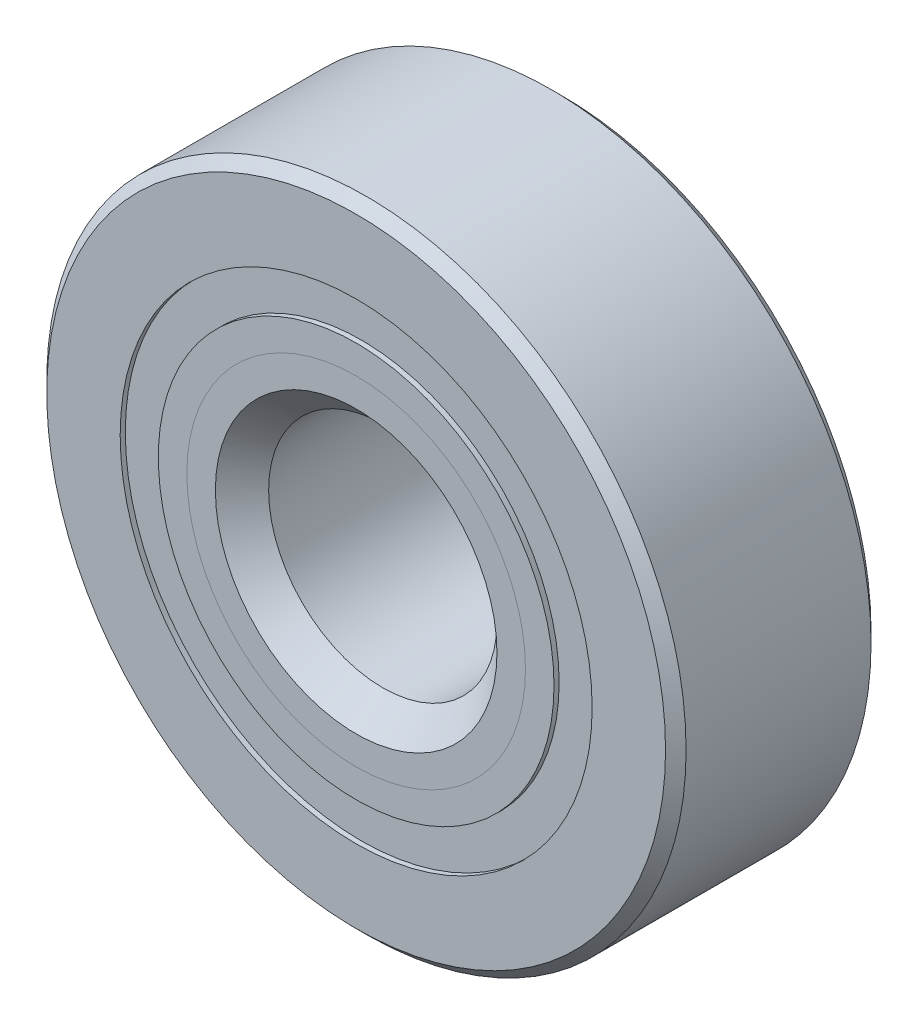
ISO-10303-21;
HEADER;
FILE_DESCRIPTION(('STEP AP214'),'2;1');
FILE_NAME('part.step','',(''),(''),'','','');
FILE_SCHEMA(('AUTOMOTIVE_DESIGN { 1 0 10303 214 1 1 1 1 }'));
ENDSEC;
DATA;
#1=APPLICATION_CONTEXT('core data for automotive mechanical design processes');
#2=APPLICATION_PROTOCOL_DEFINITION('international standard','automotive_design',2000,#1);
#3=PRODUCT_CONTEXT('',#1,'mechanical');
#4=PRODUCT('Part','Part','',(#3));
#5=PRODUCT_RELATED_PRODUCT_CATEGORY('part','',(#4));
#6=PRODUCT_DEFINITION_FORMATION('','',#4);
#7=PRODUCT_DEFINITION_CONTEXT('part definition',#1,'design');
#8=PRODUCT_DEFINITION('design','',#6,#7);
#9=PRODUCT_DEFINITION_SHAPE('','',#8);
#10=(LENGTH_UNIT() NAMED_UNIT(*) SI_UNIT(.MILLI.,.METRE.));
#11=(NAMED_UNIT(*) PLANE_ANGLE_UNIT() SI_UNIT($,.RADIAN.));
#12=(NAMED_UNIT(*) SI_UNIT($,.STERADIAN.) SOLID_ANGLE_UNIT());
#13=UNCERTAINTY_MEASURE_WITH_UNIT(LENGTH_MEASURE(1.E-05),#10,'distance_accuracy_value','');
#14=(GEOMETRIC_REPRESENTATION_CONTEXT(3) GLOBAL_UNCERTAINTY_ASSIGNED_CONTEXT((#13)) GLOBAL_UNIT_ASSIGNED_CONTEXT((#10,
#11,#12)) REPRESENTATION_CONTEXT('',''));
#15=CARTESIAN_POINT('',(0.,0.,0.));
#16=DIRECTION('',(0.,0.,1.));
#17=DIRECTION('',(1.,0.,0.));
#18=AXIS2_PLACEMENT_3D('',#15,#16,#17);
#19=CARTESIAN_POINT('',(0.,8.20353708791208,-3.39328125));
#20=DIRECTION('',(0.,0.,1.));
#21=DIRECTION('',(1.,0.,0.));
#22=AXIS2_PLACEMENT_3D('',#19,#20,#21);
#23=PLANE('',#22);
#24=CARTESIAN_POINT('',(0.,0.,-3.39328125000001));
#25=DIRECTION('',(0.,0.,1.));
#26=DIRECTION('',(1.,0.,0.));
#27=AXIS2_PLACEMENT_3D('',#24,#25,#26);
#28=CIRCLE('',#27,8.20353708791208);
#29=CARTESIAN_POINT('',(8.20353708791208,0.,-3.39328125000001));
#30=VERTEX_POINT('',#29);
#31=EDGE_CURVE('E60',#30,#30,#28,.T.);
#32=ORIENTED_EDGE('',*,*,#31,.F.);
#33=EDGE_LOOP('',(#32));
#34=FACE_BOUND('',#33,.T.);
#35=CARTESIAN_POINT('',(0.,0.,-3.39328125));
#36=DIRECTION('',(0.,0.,1.));
#37=DIRECTION('',(1.,0.,0.));
#38=AXIS2_PLACEMENT_3D('',#35,#36,#37);
#39=CIRCLE('',#38,6.87771291208791);
#40=CARTESIAN_POINT('',(6.87771291208791,0.,-3.39328125));
#41=VERTEX_POINT('',#40);
#42=EDGE_CURVE('E11',#41,#41,#39,.T.);
#43=ORIENTED_EDGE('',*,*,#42,.T.);
#44=EDGE_LOOP('',(#43));
#45=FACE_BOUND('',#44,.T.);
#46=ADVANCED_FACE('F46',(#34,#45),#23,.F.);
#47=CARTESIAN_POINT('',(0.,0.,3.571875));
#48=DIRECTION('',(0.,0.,1.));
#49=DIRECTION('',(1.,0.,0.));
#50=AXIS2_PLACEMENT_3D('',#47,#48,#49);
#51=CYLINDRICAL_SURFACE('',#50,6.87771291208791);
#52=ORIENTED_EDGE('',*,*,#42,.F.);
#53=EDGE_LOOP('',(#52));
#54=FACE_BOUND('',#53,.T.);
#55=CARTESIAN_POINT('',(0.,0.,-1.72035132641562));
#56=DIRECTION('',(0.,0.,1.));
#57=DIRECTION('',(1.,0.,0.));
#58=AXIS2_PLACEMENT_3D('',#55,#56,#57);
#59=CIRCLE('',#58,6.87771291208791);
#60=CARTESIAN_POINT('',(6.87771291208791,0.,-1.72035132641562));
#61=VERTEX_POINT('',#60);
#62=EDGE_CURVE('E52',#61,#61,#59,.T.);
#63=ORIENTED_EDGE('',*,*,#62,.T.);
#64=EDGE_LOOP('',(#63));
#65=FACE_BOUND('',#64,.T.);
#66=ADVANCED_FACE('F69',(#54,#65),#51,.F.);
#67=CARTESIAN_POINT('',(0.,8.20353708791208,-1.72035132641562));
#68=DIRECTION('',(0.,0.,-1.));
#69=DIRECTION('',(-1.,0.,0.));
#70=AXIS2_PLACEMENT_3D('',#67,#68,#69);
#71=PLANE('',#70);
#72=ORIENTED_EDGE('',*,*,#62,.F.);
#73=EDGE_LOOP('',(#72));
#74=FACE_BOUND('',#73,.T.);
#75=CARTESIAN_POINT('',(0.,0.,-1.72035132641562));
#76=DIRECTION('',(0.,0.,1.));
#77=DIRECTION('',(1.,0.,0.));
#78=AXIS2_PLACEMENT_3D('',#75,#76,#77);
#79=CIRCLE('',#78,8.20353708791208);
#80=CARTESIAN_POINT('',(8.20353708791208,0.,-1.72035132641562));
#81=VERTEX_POINT('',#80);
#82=EDGE_CURVE('E56',#81,#81,#79,.T.);
#83=ORIENTED_EDGE('',*,*,#82,.T.);
#84=EDGE_LOOP('',(#83));
#85=FACE_BOUND('',#84,.T.);
#86=ADVANCED_FACE('F73',(#74,#85),#71,.F.);
#87=CARTESIAN_POINT('',(0.,0.,3.571875));
#88=DIRECTION('',(0.,0.,1.));
#89=DIRECTION('',(1.,0.,0.));
#90=AXIS2_PLACEMENT_3D('',#87,#88,#89);
#91=CYLINDRICAL_SURFACE('',#90,8.20353708791208);
#92=ORIENTED_EDGE('',*,*,#82,.F.);
#93=EDGE_LOOP('',(#92));
#94=FACE_BOUND('',#93,.T.);
#95=ORIENTED_EDGE('',*,*,#31,.T.);
#96=EDGE_LOOP('',(#95));
#97=FACE_BOUND('',#96,.T.);
#98=ADVANCED_FACE('F66',(#94,#97),#91,.T.);
#99=CLOSED_SHELL('',(#46,#66,#86,#98));
#100=MANIFOLD_SOLID_BREP('B2',#99);
#101=CARTESIAN_POINT('',(0.,8.20353708791208,3.39328125));
#102=DIRECTION('',(0.,0.,-1.));
#103=DIRECTION('',(-1.,0.,0.));
#104=AXIS2_PLACEMENT_3D('',#101,#102,#103);
#105=PLANE('',#104);
#106=CARTESIAN_POINT('',(0.,0.,3.39328125));
#107=DIRECTION('',(0.,0.,1.));
#108=DIRECTION('',(1.,0.,0.));
#109=AXIS2_PLACEMENT_3D('',#106,#107,#108);
#110=CIRCLE('',#109,6.87771291208791);
#111=CARTESIAN_POINT('',(6.87771291208791,0.,3.39328125));
#112=VERTEX_POINT('',#111);
#113=EDGE_CURVE('E45',#112,#112,#110,.T.);
#114=ORIENTED_EDGE('',*,*,#113,.F.);
#115=EDGE_LOOP('',(#114));
#116=FACE_BOUND('',#115,.T.);
#117=CARTESIAN_POINT('',(0.,0.,3.39328125));
#118=DIRECTION('',(0.,0.,1.));
#119=DIRECTION('',(1.,0.,0.));
#120=AXIS2_PLACEMENT_3D('',#117,#118,#119);
#121=CIRCLE('',#120,8.20353708791208);
#122=CARTESIAN_POINT('',(8.20353708791208,0.,3.39328125));
#123=VERTEX_POINT('',#122);
#124=EDGE_CURVE('E130',#123,#123,#121,.T.);
#125=ORIENTED_EDGE('',*,*,#124,.T.);
#126=EDGE_LOOP('',(#125));
#127=FACE_BOUND('',#126,.T.);
#128=ADVANCED_FACE('F116',(#116,#127),#105,.F.);
#129=CARTESIAN_POINT('',(0.,0.,3.571875));
#130=DIRECTION('',(0.,0.,1.));
#131=DIRECTION('',(1.,0.,0.));
#132=AXIS2_PLACEMENT_3D('',#129,#130,#131);
#133=CYLINDRICAL_SURFACE('',#132,6.87771291208791);
#134=CARTESIAN_POINT('',(0.,0.,1.72035132641561));
#135=DIRECTION('',(0.,0.,1.));
#136=DIRECTION('',(1.,0.,0.));
#137=AXIS2_PLACEMENT_3D('',#134,#135,#136);
#138=CIRCLE('',#137,6.87771291208791);
#139=CARTESIAN_POINT('',(6.87771291208791,0.,1.72035132641561));
#140=VERTEX_POINT('',#139);
#141=EDGE_CURVE('E122',#140,#140,#138,.T.);
#142=ORIENTED_EDGE('',*,*,#141,.F.);
#143=EDGE_LOOP('',(#142));
#144=FACE_BOUND('',#143,.T.);
#145=ORIENTED_EDGE('',*,*,#113,.T.);
#146=EDGE_LOOP('',(#145));
#147=FACE_BOUND('',#146,.T.);
#148=ADVANCED_FACE('F145',(#144,#147),#133,.F.);
#149=CARTESIAN_POINT('',(0.,8.20353708791208,1.72035132641561));
#150=DIRECTION('',(0.,0.,1.));
#151=DIRECTION('',(1.,0.,0.));
#152=AXIS2_PLACEMENT_3D('',#149,#150,#151);
#153=PLANE('',#152);
#154=CARTESIAN_POINT('',(0.,0.,1.72035132641561));
#155=DIRECTION('',(0.,0.,1.));
#156=DIRECTION('',(1.,0.,0.));
#157=AXIS2_PLACEMENT_3D('',#154,#155,#156);
#158=CIRCLE('',#157,8.20353708791208);
#159=CARTESIAN_POINT('',(8.20353708791208,0.,1.72035132641561));
#160=VERTEX_POINT('',#159);
#161=EDGE_CURVE('E126',#160,#160,#158,.T.);
#162=ORIENTED_EDGE('',*,*,#161,.F.);
#163=EDGE_LOOP('',(#162));
#164=FACE_BOUND('',#163,.T.);
#165=ORIENTED_EDGE('',*,*,#141,.T.);
#166=EDGE_LOOP('',(#165));
#167=FACE_BOUND('',#166,.T.);
#168=ADVANCED_FACE('F140',(#164,#167),#153,.F.);
#169=CARTESIAN_POINT('',(0.,0.,3.571875));
#170=DIRECTION('',(0.,0.,1.));
#171=DIRECTION('',(1.,0.,0.));
#172=AXIS2_PLACEMENT_3D('',#169,#170,#171);
#173=CYLINDRICAL_SURFACE('',#172,8.20353708791208);
#174=ORIENTED_EDGE('',*,*,#124,.F.);
#175=EDGE_LOOP('',(#174));
#176=FACE_BOUND('',#175,.T.);
#177=ORIENTED_EDGE('',*,*,#161,.T.);
#178=EDGE_LOOP('',(#177));
#179=FACE_BOUND('',#178,.T.);
#180=ADVANCED_FACE('F137',(#176,#179),#173,.T.);
#181=CLOSED_SHELL('',(#128,#148,#168,#180));
#182=MANIFOLD_SOLID_BREP('B6',#181);
#183=CARTESIAN_POINT('',(-4.43226816806785,6.10049377320864,0.));
#184=DIRECTION('',(0.,0.,1.));
#185=DIRECTION('',(-0.587785252292462,0.809016994374955,0.));
#186=AXIS2_PLACEMENT_3D('',#183,#184,#185);
#187=SPHERICAL_SURFACE('',#186,1.72035132641561);
#188=CARTESIAN_POINT('',(-4.43226816806785,6.10049377320864,1.72035132641561));
#189=VERTEX_POINT('',#188);
#190=VERTEX_LOOP('',#189);
#191=FACE_BOUND('',#190,.T.);
#192=ADVANCED_FACE('F186',(#191),#187,.T.);
#193=CLOSED_SHELL('',(#192));
#194=MANIFOLD_SOLID_BREP('B40',#193);
#195=CARTESIAN_POINT('',(-7.17156054318811,2.33018127320867,0.));
#196=DIRECTION('',(0.,0.,1.));
#197=DIRECTION('',(-0.95105651629515,0.309016994374958,0.));
#198=AXIS2_PLACEMENT_3D('',#195,#196,#197);
#199=SPHERICAL_SURFACE('',#198,1.72035132641561);
#200=CARTESIAN_POINT('',(-7.17156054318811,2.33018127320867,1.72035132641561));
#201=VERTEX_POINT('',#200);
#202=VERTEX_LOOP('',#201);
#203=FACE_BOUND('',#202,.T.);
#204=ADVANCED_FACE('F221',(#203),#199,.T.);
#205=CLOSED_SHELL('',(#204));
#206=MANIFOLD_SOLID_BREP('B112',#205);
#207=CARTESIAN_POINT('',(-7.17156054318816,-2.33018127320852,0.));
#208=DIRECTION('',(0.,0.,1.));
#209=DIRECTION('',(-0.951056516295157,-0.309016994374938,0.));
#210=AXIS2_PLACEMENT_3D('',#207,#208,#209);
#211=SPHERICAL_SURFACE('',#210,1.72035132641561);
#212=CARTESIAN_POINT('',(-7.17156054318816,-2.33018127320852,1.72035132641561));
#213=VERTEX_POINT('',#212);
#214=VERTEX_LOOP('',#213);
#215=FACE_BOUND('',#214,.T.);
#216=ADVANCED_FACE('F256',(#215),#211,.T.);
#217=CLOSED_SHELL('',(#216));
#218=MANIFOLD_SOLID_BREP('B182',#217);
#219=CARTESIAN_POINT('',(-4.43226816806798,-6.10049377320855,0.));
#220=DIRECTION('',(0.,0.,1.));
#221=DIRECTION('',(-0.58778525229248,-0.809016994374942,0.));
#222=AXIS2_PLACEMENT_3D('',#219,#220,#221);
#223=SPHERICAL_SURFACE('',#222,1.72035132641561);
#224=CARTESIAN_POINT('',(-4.43226816806798,-6.10049377320855,1.72035132641561));
#225=VERTEX_POINT('',#224);
#226=VERTEX_LOOP('',#225);
#227=FACE_BOUND('',#226,.T.);
#228=ADVANCED_FACE('F291',(#227),#223,.T.);
#229=CLOSED_SHELL('',(#228));
#230=MANIFOLD_SOLID_BREP('B217',#229);
#231=CARTESIAN_POINT('',(0.,-7.540625,0.));
#232=DIRECTION('',(0.,0.,1.));
#233=DIRECTION('',(0.,-1.,0.));
#234=AXIS2_PLACEMENT_3D('',#231,#232,#233);
#235=SPHERICAL_SURFACE('',#234,1.72035132641561);
#236=CARTESIAN_POINT('',(0.,-7.540625,1.72035132641561));
#237=VERTEX_POINT('',#236);
#238=VERTEX_LOOP('',#237);
#239=FACE_BOUND('',#238,.T.);
#240=ADVANCED_FACE('F326',(#239),#235,.T.);
#241=CLOSED_SHELL('',(#240));
#242=MANIFOLD_SOLID_BREP('B252',#241);
#243=CARTESIAN_POINT('',(4.4322681680679,-6.10049377320861,0.));
#244=DIRECTION('',(0.,0.,1.));
#245=DIRECTION('',(0.587785252292469,-0.809016994374951,0.));
#246=AXIS2_PLACEMENT_3D('',#243,#244,#245);
#247=SPHERICAL_SURFACE('',#246,1.72035132641561);
#248=CARTESIAN_POINT('',(4.4322681680679,-6.10049377320861,1.72035132641561));
#249=VERTEX_POINT('',#248);
#250=VERTEX_LOOP('',#249);
#251=FACE_BOUND('',#250,.T.);
#252=ADVANCED_FACE('F361',(#251),#247,.T.);
#253=CLOSED_SHELL('',(#252));
#254=MANIFOLD_SOLID_BREP('B287',#253);
#255=CARTESIAN_POINT('',(7.17156054318813,-2.33018127320862,0.));
#256=DIRECTION('',(0.,0.,1.));
#257=DIRECTION('',(0.951056516295152,-0.309016994374952,0.));
#258=AXIS2_PLACEMENT_3D('',#255,#256,#257);
#259=SPHERICAL_SURFACE('',#258,1.72035132641561);
#260=CARTESIAN_POINT('',(7.17156054318813,-2.33018127320862,1.72035132641561));
#261=VERTEX_POINT('',#260);
#262=VERTEX_LOOP('',#261);
#263=FACE_BOUND('',#262,.T.);
#264=ADVANCED_FACE('F396',(#263),#259,.T.);
#265=CLOSED_SHELL('',(#264));
#266=MANIFOLD_SOLID_BREP('B322',#265);
#267=CARTESIAN_POINT('',(7.17156054318815,2.33018127320857,0.));
#268=DIRECTION('',(0.,0.,1.));
#269=DIRECTION('',(0.951056516295155,0.309016994374945,0.));
#270=AXIS2_PLACEMENT_3D('',#267,#268,#269);
#271=SPHERICAL_SURFACE('',#270,1.72035132641561);
#272=CARTESIAN_POINT('',(7.17156054318815,2.33018127320857,1.72035132641561));
#273=VERTEX_POINT('',#272);
#274=VERTEX_LOOP('',#273);
#275=FACE_BOUND('',#274,.T.);
#276=ADVANCED_FACE('F431',(#275),#271,.T.);
#277=CLOSED_SHELL('',(#276));
#278=MANIFOLD_SOLID_BREP('B357',#277);
#279=CARTESIAN_POINT('',(4.43226816806794,6.10049377320858,0.));
#280=DIRECTION('',(0.,0.,1.));
#281=DIRECTION('',(0.587785252292474,0.809016994374947,0.));
#282=AXIS2_PLACEMENT_3D('',#279,#280,#281);
#283=SPHERICAL_SURFACE('',#282,1.72035132641561);
#284=CARTESIAN_POINT('',(4.43226816806794,6.10049377320858,1.72035132641561));
#285=VERTEX_POINT('',#284);
#286=VERTEX_LOOP('',#285);
#287=FACE_BOUND('',#286,.T.);
#288=ADVANCED_FACE('F466',(#287),#283,.T.);
#289=CLOSED_SHELL('',(#288));
#290=MANIFOLD_SOLID_BREP('B392',#289);
#291=CARTESIAN_POINT('',(0.,7.540625,0.));
#292=DIRECTION('',(0.,0.,1.));
#293=DIRECTION('',(0.,1.,0.));
#294=AXIS2_PLACEMENT_3D('',#291,#292,#293);
#295=SPHERICAL_SURFACE('',#294,1.72035132641561);
#296=CARTESIAN_POINT('',(0.,7.540625,1.72035132641561));
#297=VERTEX_POINT('',#296);
#298=VERTEX_LOOP('',#297);
#299=FACE_BOUND('',#298,.T.);
#300=ADVANCED_FACE('F503',(#299),#295,.T.);
#301=CLOSED_SHELL('',(#300));
#302=MANIFOLD_SOLID_BREP('B427',#301);
#303=CARTESIAN_POINT('',(0.,5.88611237444005,3.571875));
#304=DIRECTION('',(0.,0.,-1.));
#305=DIRECTION('',(-1.,0.,0.));
#306=AXIS2_PLACEMENT_3D('',#303,#304,#305);
#307=PLANE('',#306);
#308=CARTESIAN_POINT('',(0.,0.,3.571875));
#309=DIRECTION('',(0.,0.,1.));
#310=DIRECTION('',(1.,0.,0.));
#311=AXIS2_PLACEMENT_3D('',#308,#309,#310);
#312=CIRCLE('',#311,4.89451183679219);
#313=CARTESIAN_POINT('',(4.89451183679219,0.,3.571875));
#314=VERTEX_POINT('',#313);
#315=EDGE_CURVE('E560',#314,#314,#312,.T.);
#316=ORIENTED_EDGE('',*,*,#315,.F.);
#317=EDGE_LOOP('',(#316));
#318=FACE_BOUND('',#317,.T.);
#319=CARTESIAN_POINT('',(0.,0.,3.571875));
#320=DIRECTION('',(0.,0.,1.));
#321=DIRECTION('',(1.,0.,0.));
#322=AXIS2_PLACEMENT_3D('',#319,#320,#321);
#323=CIRCLE('',#322,5.88611237444005);
#324=CARTESIAN_POINT('',(5.88611237444005,0.,3.571875));
#325=VERTEX_POINT('',#324);
#326=EDGE_CURVE('E502',#325,#325,#323,.T.);
#327=ORIENTED_EDGE('',*,*,#326,.T.);
#328=EDGE_LOOP('',(#327));
#329=FACE_BOUND('',#328,.T.);
#330=ADVANCED_FACE('F526',(#318,#329),#307,.F.);
#331=CARTESIAN_POINT('',(0.,0.,2.58027446235214));
#332=DIRECTION('',(0.,0.,1.));
#333=DIRECTION('',(1.,0.,0.));
#334=AXIS2_PLACEMENT_3D('',#331,#332,#333);
#335=CONICAL_SURFACE('',#334,4.89451183679219,0.78539816339745);
#336=ORIENTED_EDGE('',*,*,#326,.F.);
#337=EDGE_LOOP('',(#336));
#338=FACE_BOUND('',#337,.T.);
#339=CARTESIAN_POINT('',(0.,0.,2.58027446235214));
#340=DIRECTION('',(0.,0.,1.));
#341=DIRECTION('',(1.,0.,0.));
#342=AXIS2_PLACEMENT_3D('',#339,#340,#341);
#343=CIRCLE('',#342,4.89451183679219);
#344=CARTESIAN_POINT('',(4.89451183679219,0.,2.58027446235214));
#345=VERTEX_POINT('',#344);
#346=EDGE_CURVE('E532',#345,#345,#343,.T.);
#347=ORIENTED_EDGE('',*,*,#346,.T.);
#348=EDGE_LOOP('',(#347));
#349=FACE_BOUND('',#348,.T.);
#350=ADVANCED_FACE('F567',(#338,#349),#335,.T.);
#351=CARTESIAN_POINT('',(0.,0.,3.571875));
#352=DIRECTION('',(0.,0.,1.));
#353=DIRECTION('',(1.,0.,0.));
#354=AXIS2_PLACEMENT_3D('',#351,#352,#353);
#355=CYLINDRICAL_SURFACE('',#354,4.89451183679219);
#356=ORIENTED_EDGE('',*,*,#346,.F.);
#357=EDGE_LOOP('',(#356));
#358=FACE_BOUND('',#357,.T.);
#359=CARTESIAN_POINT('',(0.,0.,0.));
#360=DIRECTION('',(0.,0.,1.));
#361=DIRECTION('',(1.,0.,0.));
#362=AXIS2_PLACEMENT_3D('',#359,#360,#361);
#363=CIRCLE('',#362,4.89451183679219);
#364=CARTESIAN_POINT('',(4.89451183679219,0.,0.));
#365=VERTEX_POINT('',#364);
#366=EDGE_CURVE('E536',#365,#365,#363,.T.);
#367=ORIENTED_EDGE('',*,*,#366,.T.);
#368=EDGE_LOOP('',(#367));
#369=FACE_BOUND('',#368,.T.);
#370=ADVANCED_FACE('F571',(#358,#369),#355,.T.);
#371=CARTESIAN_POINT('',(0.,4.89451183679219,0.));
#372=DIRECTION('',(0.,0.,-1.));
#373=DIRECTION('',(-1.,0.,0.));
#374=AXIS2_PLACEMENT_3D('',#371,#372,#373);
#375=PLANE('',#374);
#376=ORIENTED_EDGE('',*,*,#366,.F.);
#377=EDGE_LOOP('',(#376));
#378=FACE_BOUND('',#377,.T.);
#379=CARTESIAN_POINT('',(0.,0.,0.));
#380=DIRECTION('',(0.,0.,1.));
#381=DIRECTION('',(1.,0.,0.));
#382=AXIS2_PLACEMENT_3D('',#379,#380,#381);
#383=CIRCLE('',#382,5.82027367358438);
#384=CARTESIAN_POINT('',(5.82027367358438,0.,0.));
#385=VERTEX_POINT('',#384);
#386=EDGE_CURVE('E540',#385,#385,#383,.T.);
#387=ORIENTED_EDGE('',*,*,#386,.T.);
#388=EDGE_LOOP('',(#387));
#389=FACE_BOUND('',#388,.T.);
#390=ADVANCED_FACE('F576',(#378,#389),#375,.F.);
#391=CARTESIAN_POINT('',(0.,0.,0.));
#392=DIRECTION('',(0.,0.,1.));
#393=DIRECTION('',(1.,0.,0.));
#394=AXIS2_PLACEMENT_3D('',#391,#392,#393);
#395=TOROIDAL_SURFACE('',#394,7.540625,1.72035132641561);
#396=ORIENTED_EDGE('',*,*,#386,.F.);
#397=EDGE_LOOP('',(#396));
#398=FACE_BOUND('',#397,.T.);
#399=CARTESIAN_POINT('',(0.,0.,-1.5875));
#400=DIRECTION('',(0.,0.,1.));
#401=DIRECTION('',(1.,0.,0.));
#402=AXIS2_PLACEMENT_3D('',#399,#400,#401);
#403=CIRCLE('',#402,6.87771291208791);
#404=CARTESIAN_POINT('',(6.87771291208791,0.,-1.5875));
#405=VERTEX_POINT('',#404);
#406=EDGE_CURVE('E545',#405,#405,#403,.T.);
#407=ORIENTED_EDGE('',*,*,#406,.T.);
#408=EDGE_LOOP('',(#407));
#409=FACE_BOUND('',#408,.T.);
#410=ADVANCED_FACE('F582',(#398,#409),#395,.F.);
#411=CARTESIAN_POINT('',(0.,0.,3.571875));
#412=DIRECTION('',(0.,0.,1.));
#413=DIRECTION('',(1.,0.,0.));
#414=AXIS2_PLACEMENT_3D('',#411,#412,#413);
#415=CYLINDRICAL_SURFACE('',#414,6.87771291208791);
#416=ORIENTED_EDGE('',*,*,#406,.F.);
#417=EDGE_LOOP('',(#416));
#418=FACE_BOUND('',#417,.T.);
#419=CARTESIAN_POINT('',(0.,0.,-3.571875));
#420=DIRECTION('',(0.,0.,1.));
#421=DIRECTION('',(1.,0.,0.));
#422=AXIS2_PLACEMENT_3D('',#419,#420,#421);
#423=CIRCLE('',#422,6.87771291208792);
#424=CARTESIAN_POINT('',(6.87771291208792,0.,-3.571875));
#425=VERTEX_POINT('',#424);
#426=EDGE_CURVE('E548',#425,#425,#423,.T.);
#427=ORIENTED_EDGE('',*,*,#426,.T.);
#428=EDGE_LOOP('',(#427));
#429=FACE_BOUND('',#428,.T.);
#430=ADVANCED_FACE('F586',(#418,#429),#415,.T.);
#431=CARTESIAN_POINT('',(0.,4.3259375,-3.571875));
#432=DIRECTION('',(0.,0.,1.));
#433=DIRECTION('',(1.,0.,0.));
#434=AXIS2_PLACEMENT_3D('',#431,#432,#433);
#435=PLANE('',#434);
#436=ORIENTED_EDGE('',*,*,#426,.F.);
#437=EDGE_LOOP('',(#436));
#438=FACE_BOUND('',#437,.T.);
#439=CARTESIAN_POINT('',(0.,0.,-3.571875));
#440=DIRECTION('',(0.,0.,1.));
#441=DIRECTION('',(1.,0.,0.));
#442=AXIS2_PLACEMENT_3D('',#439,#440,#441);
#443=CIRCLE('',#442,4.3259375);
#444=CARTESIAN_POINT('',(4.3259375,0.,-3.571875));
#445=VERTEX_POINT('',#444);
#446=EDGE_CURVE('E551',#445,#445,#443,.T.);
#447=ORIENTED_EDGE('',*,*,#446,.T.);
#448=EDGE_LOOP('',(#447));
#449=FACE_BOUND('',#448,.T.);
#450=ADVANCED_FACE('F590',(#438,#449),#435,.F.);
#451=CARTESIAN_POINT('',(0.,0.,-3.2146875));
#452=DIRECTION('',(0.,0.,-1.));
#453=DIRECTION('',(-1.,0.,0.));
#454=AXIS2_PLACEMENT_3D('',#451,#452,#453);
#455=CONICAL_SURFACE('',#454,3.96875,0.78539816339745);
#456=ORIENTED_EDGE('',*,*,#446,.F.);
#457=EDGE_LOOP('',(#456));
#458=FACE_BOUND('',#457,.T.);
#459=CARTESIAN_POINT('',(0.,0.,-3.2146875));
#460=DIRECTION('',(0.,0.,1.));
#461=DIRECTION('',(1.,0.,0.));
#462=AXIS2_PLACEMENT_3D('',#459,#460,#461);
#463=CIRCLE('',#462,3.96875);
#464=CARTESIAN_POINT('',(3.96875,0.,-3.2146875));
#465=VERTEX_POINT('',#464);
#466=EDGE_CURVE('E554',#465,#465,#463,.T.);
#467=ORIENTED_EDGE('',*,*,#466,.T.);
#468=EDGE_LOOP('',(#467));
#469=FACE_BOUND('',#468,.T.);
#470=ADVANCED_FACE('F594',(#458,#469),#455,.F.);
#471=CARTESIAN_POINT('',(0.,0.,3.571875));
#472=DIRECTION('',(0.,0.,1.));
#473=DIRECTION('',(1.,0.,0.));
#474=AXIS2_PLACEMENT_3D('',#471,#472,#473);
#475=CYLINDRICAL_SURFACE('',#474,3.96875);
#476=ORIENTED_EDGE('',*,*,#466,.F.);
#477=EDGE_LOOP('',(#476));
#478=FACE_BOUND('',#477,.T.);
#479=CARTESIAN_POINT('',(0.,0.,2.64611316320781));
#480=DIRECTION('',(0.,0.,1.));
#481=DIRECTION('',(1.,0.,0.));
#482=AXIS2_PLACEMENT_3D('',#479,#480,#481);
#483=CIRCLE('',#482,3.96875);
#484=CARTESIAN_POINT('',(3.96875,0.,2.64611316320781));
#485=VERTEX_POINT('',#484);
#486=EDGE_CURVE('E557',#485,#485,#483,.T.);
#487=ORIENTED_EDGE('',*,*,#486,.T.);
#488=EDGE_LOOP('',(#487));
#489=FACE_BOUND('',#488,.T.);
#490=ADVANCED_FACE('F598',(#478,#489),#475,.F.);
#491=CARTESIAN_POINT('',(0.,0.,3.571875));
#492=DIRECTION('',(0.,0.,1.));
#493=DIRECTION('',(1.,0.,0.));
#494=AXIS2_PLACEMENT_3D('',#491,#492,#493);
#495=CONICAL_SURFACE('',#494,4.89451183679219,0.78539816339745);
#496=ORIENTED_EDGE('',*,*,#486,.F.);
#497=EDGE_LOOP('',(#496));
#498=FACE_BOUND('',#497,.T.);
#499=ORIENTED_EDGE('',*,*,#315,.T.);
#500=EDGE_LOOP('',(#499));
#501=FACE_BOUND('',#500,.T.);
#502=ADVANCED_FACE('F564',(#498,#501),#495,.F.);
#503=CLOSED_SHELL('',(#330,#350,#370,#390,#410,#430,#450,#470,#490,#502));
#504=MANIFOLD_SOLID_BREP('B462',#503);
#505=CARTESIAN_POINT('',(0.,6.87771291208791,3.571875));
#506=DIRECTION('',(0.,0.,-1.));
#507=DIRECTION('',(-1.,0.,0.));
#508=AXIS2_PLACEMENT_3D('',#505,#506,#507);
#509=PLANE('',#508);
#510=CARTESIAN_POINT('',(0.,0.,3.571875));
#511=DIRECTION('',(0.,0.,1.));
#512=DIRECTION('',(1.,0.,0.));
#513=AXIS2_PLACEMENT_3D('',#510,#511,#512);
#514=CIRCLE('',#513,5.88611237444005);
#515=CARTESIAN_POINT('',(5.88611237444005,0.,3.571875));
#516=VERTEX_POINT('',#515);
#517=EDGE_CURVE('E525',#516,#516,#514,.T.);
#518=ORIENTED_EDGE('',*,*,#517,.F.);
#519=EDGE_LOOP('',(#518));
#520=FACE_BOUND('',#519,.T.);
#521=CARTESIAN_POINT('',(0.,0.,3.571875));
#522=DIRECTION('',(0.,0.,1.));
#523=DIRECTION('',(1.,0.,0.));
#524=AXIS2_PLACEMENT_3D('',#521,#522,#523);
#525=CIRCLE('',#524,6.87771291208791);
#526=CARTESIAN_POINT('',(6.87771291208791,0.,3.571875));
#527=VERTEX_POINT('',#526);
#528=EDGE_CURVE('E709',#527,#527,#525,.T.);
#529=ORIENTED_EDGE('',*,*,#528,.T.);
#530=EDGE_LOOP('',(#529));
#531=FACE_BOUND('',#530,.T.);
#532=ADVANCED_FACE('F687',(#520,#531),#509,.F.);
#533=CARTESIAN_POINT('',(0.,0.,3.571875));
#534=DIRECTION('',(0.,0.,1.));
#535=DIRECTION('',(1.,0.,0.));
#536=AXIS2_PLACEMENT_3D('',#533,#534,#535);
#537=CONICAL_SURFACE('',#536,5.88611237444005,0.78539816339745);
#538=CARTESIAN_POINT('',(0.,0.,2.58027446235214));
#539=DIRECTION('',(0.,0.,1.));
#540=DIRECTION('',(1.,0.,0.));
#541=AXIS2_PLACEMENT_3D('',#538,#539,#540);
#542=CIRCLE('',#541,4.89451183679219);
#543=CARTESIAN_POINT('',(4.89451183679219,0.,2.58027446235214));
#544=VERTEX_POINT('',#543);
#545=EDGE_CURVE('E693',#544,#544,#542,.T.);
#546=ORIENTED_EDGE('',*,*,#545,.F.);
#547=EDGE_LOOP('',(#546));
#548=FACE_BOUND('',#547,.T.);
#549=ORIENTED_EDGE('',*,*,#517,.T.);
#550=EDGE_LOOP('',(#549));
#551=FACE_BOUND('',#550,.T.);
#552=ADVANCED_FACE('F734',(#548,#551),#537,.F.);
#553=CARTESIAN_POINT('',(0.,0.,3.571875));
#554=DIRECTION('',(0.,0.,1.));
#555=DIRECTION('',(1.,0.,0.));
#556=AXIS2_PLACEMENT_3D('',#553,#554,#555);
#557=CYLINDRICAL_SURFACE('',#556,4.89451183679219);
#558=CARTESIAN_POINT('',(0.,0.,0.));
#559=DIRECTION('',(0.,0.,1.));
#560=DIRECTION('',(1.,0.,0.));
#561=AXIS2_PLACEMENT_3D('',#558,#559,#560);
#562=CIRCLE('',#561,4.89451183679219);
#563=CARTESIAN_POINT('',(4.89451183679219,0.,0.));
#564=VERTEX_POINT('',#563);
#565=EDGE_CURVE('E697',#564,#564,#562,.T.);
#566=ORIENTED_EDGE('',*,*,#565,.F.);
#567=EDGE_LOOP('',(#566));
#568=FACE_BOUND('',#567,.T.);
#569=ORIENTED_EDGE('',*,*,#545,.T.);
#570=EDGE_LOOP('',(#569));
#571=FACE_BOUND('',#570,.T.);
#572=ADVANCED_FACE('F729',(#568,#571),#557,.F.);
#573=CARTESIAN_POINT('',(0.,4.89451183679219,0.));
#574=DIRECTION('',(0.,0.,1.));
#575=DIRECTION('',(1.,0.,0.));
#576=AXIS2_PLACEMENT_3D('',#573,#574,#575);
#577=PLANE('',#576);
#578=CARTESIAN_POINT('',(0.,0.,0.));
#579=DIRECTION('',(0.,0.,1.));
#580=DIRECTION('',(1.,0.,0.));
#581=AXIS2_PLACEMENT_3D('',#578,#579,#580);
#582=CIRCLE('',#581,5.82027367358438);
#583=CARTESIAN_POINT('',(5.82027367358438,0.,0.));
#584=VERTEX_POINT('',#583);
#585=EDGE_CURVE('E701',#584,#584,#582,.T.);
#586=ORIENTED_EDGE('',*,*,#585,.F.);
#587=EDGE_LOOP('',(#586));
#588=FACE_BOUND('',#587,.T.);
#589=ORIENTED_EDGE('',*,*,#565,.T.);
#590=EDGE_LOOP('',(#589));
#591=FACE_BOUND('',#590,.T.);
#592=ADVANCED_FACE('F723',(#588,#591),#577,.F.);
#593=CARTESIAN_POINT('',(0.,0.,0.));
#594=DIRECTION('',(0.,0.,1.));
#595=DIRECTION('',(1.,0.,0.));
#596=AXIS2_PLACEMENT_3D('',#593,#594,#595);
#597=TOROIDAL_SURFACE('',#596,7.540625,1.72035132641561);
#598=CARTESIAN_POINT('',(0.,0.,1.5875));
#599=DIRECTION('',(0.,0.,1.));
#600=DIRECTION('',(1.,0.,0.));
#601=AXIS2_PLACEMENT_3D('',#598,#599,#600);
#602=CIRCLE('',#601,6.87771291208791);
#603=CARTESIAN_POINT('',(6.87771291208791,0.,1.5875));
#604=VERTEX_POINT('',#603);
#605=EDGE_CURVE('E706',#604,#604,#602,.T.);
#606=ORIENTED_EDGE('',*,*,#605,.F.);
#607=EDGE_LOOP('',(#606));
#608=FACE_BOUND('',#607,.T.);
#609=ORIENTED_EDGE('',*,*,#585,.T.);
#610=EDGE_LOOP('',(#609));
#611=FACE_BOUND('',#610,.T.);
#612=ADVANCED_FACE('F717',(#608,#611),#597,.F.);
#613=CARTESIAN_POINT('',(0.,0.,3.571875));
#614=DIRECTION('',(0.,0.,1.));
#615=DIRECTION('',(1.,0.,0.));
#616=AXIS2_PLACEMENT_3D('',#613,#614,#615);
#617=CYLINDRICAL_SURFACE('',#616,6.87771291208791);
#618=ORIENTED_EDGE('',*,*,#528,.F.);
#619=EDGE_LOOP('',(#618));
#620=FACE_BOUND('',#619,.T.);
#621=ORIENTED_EDGE('',*,*,#605,.T.);
#622=EDGE_LOOP('',(#621));
#623=FACE_BOUND('',#622,.T.);
#624=ADVANCED_FACE('F714',(#620,#623),#617,.T.);
#625=CLOSED_SHELL('',(#532,#552,#572,#592,#612,#624));
#626=MANIFOLD_SOLID_BREP('B497',#625);
#627=CARTESIAN_POINT('',(0.,0.,3.2146875));
#628=DIRECTION('',(0.,0.,-1.));
#629=DIRECTION('',(-1.,0.,0.));
#630=AXIS2_PLACEMENT_3D('',#627,#628,#629);
#631=CONICAL_SURFACE('',#630,11.1125,0.785398163397448);
#632=CARTESIAN_POINT('',(0.,0.,3.571875));
#633=DIRECTION('',(0.,0.,1.));
#634=DIRECTION('',(1.,0.,0.));
#635=AXIS2_PLACEMENT_3D('',#632,#633,#634);
#636=CIRCLE('',#635,10.7553125);
#637=CARTESIAN_POINT('',(10.7553125,0.,3.571875));
#638=VERTEX_POINT('',#637);
#639=EDGE_CURVE('E809',#638,#638,#636,.T.);
#640=ORIENTED_EDGE('',*,*,#639,.F.);
#641=EDGE_LOOP('',(#640));
#642=FACE_BOUND('',#641,.T.);
#643=CARTESIAN_POINT('',(0.,0.,3.2146875));
#644=DIRECTION('',(0.,0.,1.));
#645=DIRECTION('',(1.,0.,0.));
#646=AXIS2_PLACEMENT_3D('',#643,#644,#645);
#647=CIRCLE('',#646,11.1125);
#648=CARTESIAN_POINT('',(11.1125,0.,3.2146875));
#649=VERTEX_POINT('',#648);
#650=EDGE_CURVE('E686',#649,#649,#647,.T.);
#651=ORIENTED_EDGE('',*,*,#650,.T.);
#652=EDGE_LOOP('',(#651));
#653=FACE_BOUND('',#652,.T.);
#654=ADVANCED_FACE('F781',(#642,#653),#631,.T.);
#655=CARTESIAN_POINT('',(0.,0.,3.571875));
#656=DIRECTION('',(0.,0.,1.));
#657=DIRECTION('',(1.,0.,0.));
#658=AXIS2_PLACEMENT_3D('',#655,#656,#657);
#659=CYLINDRICAL_SURFACE('',#658,11.1125);
#660=ORIENTED_EDGE('',*,*,#650,.F.);
#661=EDGE_LOOP('',(#660));
#662=FACE_BOUND('',#661,.T.);
#663=CARTESIAN_POINT('',(0.,0.,-3.2146875));
#664=DIRECTION('',(0.,0.,1.));
#665=DIRECTION('',(1.,0.,0.));
#666=AXIS2_PLACEMENT_3D('',#663,#664,#665);
#667=CIRCLE('',#666,11.1125);
#668=CARTESIAN_POINT('',(11.1125,0.,-3.2146875));
#669=VERTEX_POINT('',#668);
#670=EDGE_CURVE('E787',#669,#669,#667,.T.);
#671=ORIENTED_EDGE('',*,*,#670,.T.);
#672=EDGE_LOOP('',(#671));
#673=FACE_BOUND('',#672,.T.);
#674=ADVANCED_FACE('F816',(#662,#673),#659,.T.);
#675=CARTESIAN_POINT('',(0.,0.,-3.571875));
#676=DIRECTION('',(0.,0.,1.));
#677=DIRECTION('',(1.,0.,0.));
#678=AXIS2_PLACEMENT_3D('',#675,#676,#677);
#679=CONICAL_SURFACE('',#678,10.7553125,0.785398163397446);
#680=ORIENTED_EDGE('',*,*,#670,.F.);
#681=EDGE_LOOP('',(#680));
#682=FACE_BOUND('',#681,.T.);
#683=CARTESIAN_POINT('',(0.,0.,-3.571875));
#684=DIRECTION('',(0.,0.,1.));
#685=DIRECTION('',(1.,0.,0.));
#686=AXIS2_PLACEMENT_3D('',#683,#684,#685);
#687=CIRCLE('',#686,10.7553125);
#688=CARTESIAN_POINT('',(10.7553125,0.,-3.571875));
#689=VERTEX_POINT('',#688);
#690=EDGE_CURVE('E791',#689,#689,#687,.T.);
#691=ORIENTED_EDGE('',*,*,#690,.T.);
#692=EDGE_LOOP('',(#691));
#693=FACE_BOUND('',#692,.T.);
#694=ADVANCED_FACE('F820',(#682,#693),#679,.T.);
#695=CARTESIAN_POINT('',(0.,10.7553125,-3.571875));
#696=DIRECTION('',(0.,0.,1.));
#697=DIRECTION('',(1.,0.,0.));
#698=AXIS2_PLACEMENT_3D('',#695,#696,#697);
#699=PLANE('',#698);
#700=ORIENTED_EDGE('',*,*,#690,.F.);
#701=EDGE_LOOP('',(#700));
#702=FACE_BOUND('',#701,.T.);
#703=CARTESIAN_POINT('',(0.,0.,-3.571875));
#704=DIRECTION('',(0.,0.,1.));
#705=DIRECTION('',(1.,0.,0.));
#706=AXIS2_PLACEMENT_3D('',#703,#704,#705);
#707=CIRCLE('',#706,8.20353708791209);
#708=CARTESIAN_POINT('',(8.20353708791209,0.,-3.571875));
#709=VERTEX_POINT('',#708);
#710=EDGE_CURVE('E795',#709,#709,#707,.T.);
#711=ORIENTED_EDGE('',*,*,#710,.T.);
#712=EDGE_LOOP('',(#711));
#713=FACE_BOUND('',#712,.T.);
#714=ADVANCED_FACE('F825',(#702,#713),#699,.F.);
#715=CARTESIAN_POINT('',(0.,0.,3.571875));
#716=DIRECTION('',(0.,0.,1.));
#717=DIRECTION('',(1.,0.,0.));
#718=AXIS2_PLACEMENT_3D('',#715,#716,#717);
#719=CYLINDRICAL_SURFACE('',#718,8.20353708791208);
#720=ORIENTED_EDGE('',*,*,#710,.F.);
#721=EDGE_LOOP('',(#720));
#722=FACE_BOUND('',#721,.T.);
#723=CARTESIAN_POINT('',(0.,0.,-1.5875));
#724=DIRECTION('',(0.,0.,1.));
#725=DIRECTION('',(1.,0.,0.));
#726=AXIS2_PLACEMENT_3D('',#723,#724,#725);
#727=CIRCLE('',#726,8.20353708791208);
#728=CARTESIAN_POINT('',(8.20353708791208,0.,-1.5875));
#729=VERTEX_POINT('',#728);
#730=EDGE_CURVE('E800',#729,#729,#727,.T.);
#731=ORIENTED_EDGE('',*,*,#730,.T.);
#732=EDGE_LOOP('',(#731));
#733=FACE_BOUND('',#732,.T.);
#734=ADVANCED_FACE('F831',(#722,#733),#719,.F.);
#735=CARTESIAN_POINT('',(0.,0.,0.));
#736=DIRECTION('',(0.,0.,1.));
#737=DIRECTION('',(1.,0.,0.));
#738=AXIS2_PLACEMENT_3D('',#735,#736,#737);
#739=TOROIDAL_SURFACE('',#738,7.540625,1.72035132641561);
#740=ORIENTED_EDGE('',*,*,#730,.F.);
#741=EDGE_LOOP('',(#740));
#742=FACE_BOUND('',#741,.T.);
#743=CARTESIAN_POINT('',(0.,0.,1.5875));
#744=DIRECTION('',(0.,0.,1.));
#745=DIRECTION('',(1.,0.,0.));
#746=AXIS2_PLACEMENT_3D('',#743,#744,#745);
#747=CIRCLE('',#746,8.20353708791208);
#748=CARTESIAN_POINT('',(8.20353708791208,0.,1.5875));
#749=VERTEX_POINT('',#748);
#750=EDGE_CURVE('E803',#749,#749,#747,.T.);
#751=ORIENTED_EDGE('',*,*,#750,.T.);
#752=EDGE_LOOP('',(#751));
#753=FACE_BOUND('',#752,.T.);
#754=ADVANCED_FACE('F835',(#742,#753),#739,.F.);
#755=CARTESIAN_POINT('',(0.,0.,3.571875));
#756=DIRECTION('',(0.,0.,1.));
#757=DIRECTION('',(1.,0.,0.));
#758=AXIS2_PLACEMENT_3D('',#755,#756,#757);
#759=CYLINDRICAL_SURFACE('',#758,8.20353708791208);
#760=ORIENTED_EDGE('',*,*,#750,.F.);
#761=EDGE_LOOP('',(#760));
#762=FACE_BOUND('',#761,.T.);
#763=CARTESIAN_POINT('',(0.,0.,3.571875));
#764=DIRECTION('',(0.,0.,1.));
#765=DIRECTION('',(1.,0.,0.));
#766=AXIS2_PLACEMENT_3D('',#763,#764,#765);
#767=CIRCLE('',#766,8.20353708791208);
#768=CARTESIAN_POINT('',(8.20353708791208,0.,3.571875));
#769=VERTEX_POINT('',#768);
#770=EDGE_CURVE('E806',#769,#769,#767,.T.);
#771=ORIENTED_EDGE('',*,*,#770,.T.);
#772=EDGE_LOOP('',(#771));
#773=FACE_BOUND('',#772,.T.);
#774=ADVANCED_FACE('F839',(#762,#773),#759,.F.);
#775=CARTESIAN_POINT('',(0.,10.7553125,3.571875));
#776=DIRECTION('',(0.,0.,-1.));
#777=DIRECTION('',(-1.,0.,0.));
#778=AXIS2_PLACEMENT_3D('',#775,#776,#777);
#779=PLANE('',#778);
#780=ORIENTED_EDGE('',*,*,#770,.F.);
#781=EDGE_LOOP('',(#780));
#782=FACE_BOUND('',#781,.T.);
#783=ORIENTED_EDGE('',*,*,#639,.T.);
#784=EDGE_LOOP('',(#783));
#785=FACE_BOUND('',#784,.T.);
#786=ADVANCED_FACE('F813',(#782,#785),#779,.F.);
#787=CLOSED_SHELL('',(#654,#674,#694,#714,#734,#754,#774,#786));
#788=MANIFOLD_SOLID_BREP('B520',#787);
#789=ADVANCED_BREP_SHAPE_REPRESENTATION('',(#18,#100,#182,#194,#206,#218,#230,#242,#254,#266,
#278,#290,#302,#504,#626,#788),#14);
#790=SHAPE_DEFINITION_REPRESENTATION(#9,#789);
ENDSEC;
END-ISO-10303-21;
